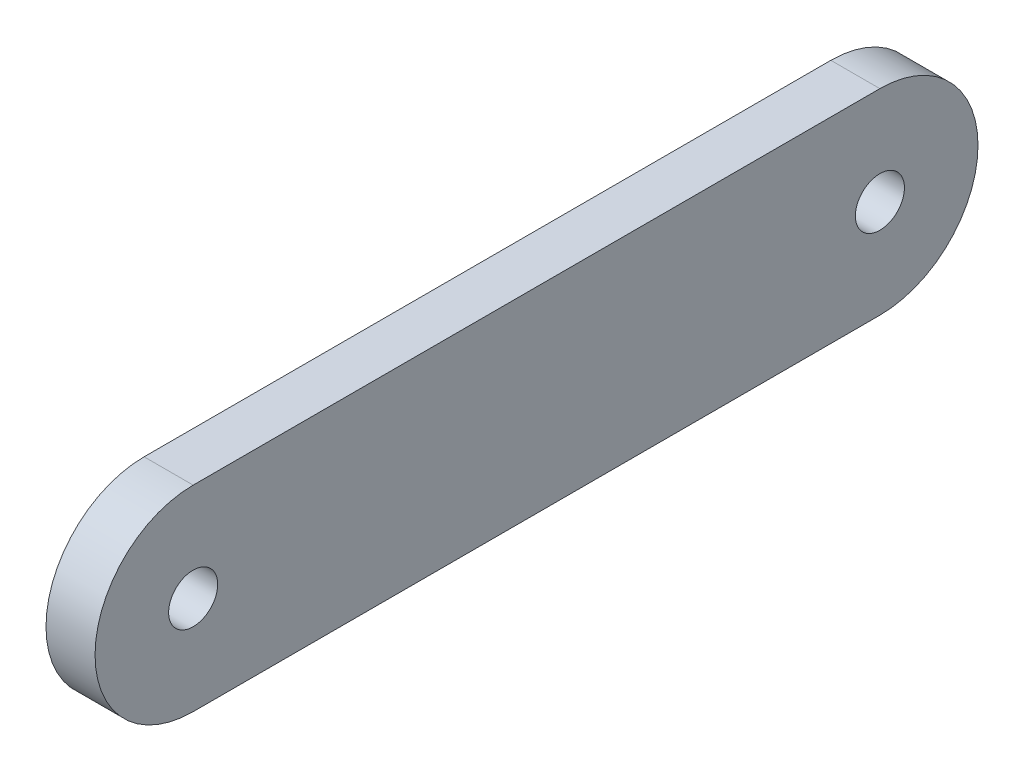
ISO-10303-21;
HEADER;
FILE_DESCRIPTION(('STEP AP214'),'2;1');
FILE_NAME('part.step','',(''),(''),'','','');
FILE_SCHEMA(('AUTOMOTIVE_DESIGN { 1 0 10303 214 1 1 1 1 }'));
ENDSEC;
DATA;
#1=APPLICATION_CONTEXT('core data for automotive mechanical design processes');
#2=APPLICATION_PROTOCOL_DEFINITION('international standard','automotive_design',2000,#1);
#3=PRODUCT_CONTEXT('',#1,'mechanical');
#4=PRODUCT('Part','Part','',(#3));
#5=PRODUCT_RELATED_PRODUCT_CATEGORY('part','',(#4));
#6=PRODUCT_DEFINITION_FORMATION('','',#4);
#7=PRODUCT_DEFINITION_CONTEXT('part definition',#1,'design');
#8=PRODUCT_DEFINITION('design','',#6,#7);
#9=PRODUCT_DEFINITION_SHAPE('','',#8);
#10=(LENGTH_UNIT() NAMED_UNIT(*) SI_UNIT(.MILLI.,.METRE.));
#11=(NAMED_UNIT(*) PLANE_ANGLE_UNIT() SI_UNIT($,.RADIAN.));
#12=(NAMED_UNIT(*) SI_UNIT($,.STERADIAN.) SOLID_ANGLE_UNIT());
#13=UNCERTAINTY_MEASURE_WITH_UNIT(LENGTH_MEASURE(1.E-05),#10,'distance_accuracy_value','');
#14=(GEOMETRIC_REPRESENTATION_CONTEXT(3) GLOBAL_UNCERTAINTY_ASSIGNED_CONTEXT((#13)) GLOBAL_UNIT_ASSIGNED_CONTEXT((#10,
#11,#12)) REPRESENTATION_CONTEXT('',''));
#15=CARTESIAN_POINT('',(0.,0.,0.));
#16=DIRECTION('',(0.,0.,1.));
#17=DIRECTION('',(1.,0.,0.));
#18=AXIS2_PLACEMENT_3D('',#15,#16,#17);
#19=CARTESIAN_POINT('',(5.,0.,0.));
#20=DIRECTION('',(1.,0.,0.));
#21=DIRECTION('',(0.,0.,-1.));
#22=AXIS2_PLACEMENT_3D('',#19,#20,#21);
#23=PLANE('',#22);
#24=CARTESIAN_POINT('',(5.,0.,0.));
#25=DIRECTION('',(1.,0.,0.));
#26=DIRECTION('',(0.,0.,-1.));
#27=AXIS2_PLACEMENT_3D('',#24,#25,#26);
#28=CIRCLE('',#27,2.5);
#29=CARTESIAN_POINT('',(5.,0.,-2.5));
#30=VERTEX_POINT('',#29);
#31=EDGE_CURVE('E100',#30,#30,#28,.T.);
#32=ORIENTED_EDGE('',*,*,#31,.F.);
#33=EDGE_LOOP('',(#32));
#34=FACE_BOUND('',#33,.T.);
#35=CARTESIAN_POINT('',(5.,0.,0.));
#36=DIRECTION('',(1.,0.,0.));
#37=DIRECTION('',(0.,0.,-1.));
#38=AXIS2_PLACEMENT_3D('',#35,#36,#37);
#39=CIRCLE('',#38,10.);
#40=CARTESIAN_POINT('',(5.,10.,0.));
#41=VERTEX_POINT('',#40);
#42=CARTESIAN_POINT('',(5.,-10.,0.));
#43=VERTEX_POINT('',#42);
#44=EDGE_CURVE('E85',#41,#43,#39,.T.);
#45=ORIENTED_EDGE('',*,*,#44,.T.);
#46=DIRECTION('',(0.,0.,-1.));
#47=VECTOR('',#46,1.);
#48=CARTESIAN_POINT('',(5.,-10.,0.));
#49=LINE('',#48,#47);
#50=CARTESIAN_POINT('',(5.,-10.,-70.));
#51=VERTEX_POINT('',#50);
#52=EDGE_CURVE('E80',#43,#51,#49,.T.);
#53=ORIENTED_EDGE('',*,*,#52,.T.);
#54=CARTESIAN_POINT('',(5.,0.,-70.));
#55=DIRECTION('',(1.,0.,0.));
#56=DIRECTION('',(0.,0.,-1.));
#57=AXIS2_PLACEMENT_3D('',#54,#55,#56);
#58=CIRCLE('',#57,10.);
#59=CARTESIAN_POINT('',(5.,10.,-70.));
#60=VERTEX_POINT('',#59);
#61=EDGE_CURVE('E83',#51,#60,#58,.T.);
#62=ORIENTED_EDGE('',*,*,#61,.T.);
#63=DIRECTION('',(0.,0.,1.));
#64=VECTOR('',#63,1.);
#65=CARTESIAN_POINT('',(5.,10.,0.));
#66=LINE('',#65,#64);
#67=EDGE_CURVE('E50',#60,#41,#66,.T.);
#68=ORIENTED_EDGE('',*,*,#67,.T.);
#69=EDGE_LOOP('',(#45,#53,#62,#68));
#70=FACE_BOUND('',#69,.T.);
#71=CARTESIAN_POINT('',(5.,0.,-70.));
#72=DIRECTION('',(1.,0.,0.));
#73=DIRECTION('',(0.,0.,-1.));
#74=AXIS2_PLACEMENT_3D('',#71,#72,#73);
#75=CIRCLE('',#74,2.5);
#76=CARTESIAN_POINT('',(5.,0.,-72.5));
#77=VERTEX_POINT('',#76);
#78=EDGE_CURVE('E115',#77,#77,#75,.T.);
#79=ORIENTED_EDGE('',*,*,#78,.F.);
#80=EDGE_LOOP('',(#79));
#81=FACE_BOUND('',#80,.T.);
#82=ADVANCED_FACE('F33',(#34,#70,#81),#23,.T.);
#83=CARTESIAN_POINT('',(0.,0.,0.));
#84=DIRECTION('',(1.,0.,0.));
#85=DIRECTION('',(0.,0.,-1.));
#86=AXIS2_PLACEMENT_3D('',#83,#84,#85);
#87=PLANE('',#86);
#88=CARTESIAN_POINT('',(0.,0.,0.));
#89=DIRECTION('',(1.,0.,0.));
#90=DIRECTION('',(0.,0.,-1.));
#91=AXIS2_PLACEMENT_3D('',#88,#89,#90);
#92=CIRCLE('',#91,10.);
#93=CARTESIAN_POINT('',(0.,10.,0.));
#94=VERTEX_POINT('',#93);
#95=CARTESIAN_POINT('',(0.,-10.,0.));
#96=VERTEX_POINT('',#95);
#97=EDGE_CURVE('E97',#94,#96,#92,.T.);
#98=ORIENTED_EDGE('',*,*,#97,.F.);
#99=DIRECTION('',(0.,0.,1.));
#100=VECTOR('',#99,1.);
#101=CARTESIAN_POINT('',(0.,10.,0.));
#102=LINE('',#101,#100);
#103=CARTESIAN_POINT('',(0.,10.,-70.));
#104=VERTEX_POINT('',#103);
#105=EDGE_CURVE('E73',#104,#94,#102,.T.);
#106=ORIENTED_EDGE('',*,*,#105,.F.);
#107=CARTESIAN_POINT('',(0.,0.,-70.));
#108=DIRECTION('',(1.,0.,0.));
#109=DIRECTION('',(0.,0.,-1.));
#110=AXIS2_PLACEMENT_3D('',#107,#108,#109);
#111=CIRCLE('',#110,10.);
#112=CARTESIAN_POINT('',(0.,-10.,-70.));
#113=VERTEX_POINT('',#112);
#114=EDGE_CURVE('E67',#113,#104,#111,.T.);
#115=ORIENTED_EDGE('',*,*,#114,.F.);
#116=DIRECTION('',(0.,0.,-1.));
#117=VECTOR('',#116,1.);
#118=CARTESIAN_POINT('',(0.,-10.,0.));
#119=LINE('',#118,#117);
#120=EDGE_CURVE('E89',#96,#113,#119,.T.);
#121=ORIENTED_EDGE('',*,*,#120,.F.);
#122=EDGE_LOOP('',(#98,#106,#115,#121));
#123=FACE_BOUND('',#122,.T.);
#124=CARTESIAN_POINT('',(0.,0.,0.));
#125=DIRECTION('',(1.,0.,0.));
#126=DIRECTION('',(0.,0.,-1.));
#127=AXIS2_PLACEMENT_3D('',#124,#125,#126);
#128=CIRCLE('',#127,2.5);
#129=CARTESIAN_POINT('',(0.,0.,-2.5));
#130=VERTEX_POINT('',#129);
#131=EDGE_CURVE('E112',#130,#130,#128,.T.);
#132=ORIENTED_EDGE('',*,*,#131,.T.);
#133=EDGE_LOOP('',(#132));
#134=FACE_BOUND('',#133,.T.);
#135=CARTESIAN_POINT('',(0.,0.,-70.));
#136=DIRECTION('',(1.,0.,0.));
#137=DIRECTION('',(0.,0.,-1.));
#138=AXIS2_PLACEMENT_3D('',#135,#136,#137);
#139=CIRCLE('',#138,2.5);
#140=CARTESIAN_POINT('',(0.,0.,-72.5));
#141=VERTEX_POINT('',#140);
#142=EDGE_CURVE('E118',#141,#141,#139,.T.);
#143=ORIENTED_EDGE('',*,*,#142,.T.);
#144=EDGE_LOOP('',(#143));
#145=FACE_BOUND('',#144,.T.);
#146=ADVANCED_FACE('F108',(#123,#134,#145),#87,.F.);
#147=CARTESIAN_POINT('',(5.,0.,0.));
#148=DIRECTION('',(-1.,0.,0.));
#149=DIRECTION('',(0.,0.,1.));
#150=AXIS2_PLACEMENT_3D('',#147,#148,#149);
#151=CYLINDRICAL_SURFACE('',#150,10.);
#152=ORIENTED_EDGE('',*,*,#97,.T.);
#153=DIRECTION('',(-1.,0.,0.));
#154=VECTOR('',#153,1.);
#155=CARTESIAN_POINT('',(5.,-10.,0.));
#156=LINE('',#155,#154);
#157=EDGE_CURVE('E11',#43,#96,#156,.T.);
#158=ORIENTED_EDGE('',*,*,#157,.F.);
#159=ORIENTED_EDGE('',*,*,#44,.F.);
#160=DIRECTION('',(-1.,0.,0.));
#161=VECTOR('',#160,1.);
#162=CARTESIAN_POINT('',(5.,10.,0.));
#163=LINE('',#162,#161);
#164=EDGE_CURVE('E93',#41,#94,#163,.T.);
#165=ORIENTED_EDGE('',*,*,#164,.T.);
#166=EDGE_LOOP('',(#152,#158,#159,#165));
#167=FACE_BOUND('',#166,.T.);
#168=ADVANCED_FACE('F35',(#167),#151,.T.);
#169=CARTESIAN_POINT('',(5.,-10.,0.));
#170=DIRECTION('',(0.,1.,0.));
#171=DIRECTION('',(0.,0.,1.));
#172=AXIS2_PLACEMENT_3D('',#169,#170,#171);
#173=PLANE('',#172);
#174=ORIENTED_EDGE('',*,*,#120,.T.);
#175=DIRECTION('',(-1.,0.,0.));
#176=VECTOR('',#175,1.);
#177=CARTESIAN_POINT('',(5.,-10.,-70.));
#178=LINE('',#177,#176);
#179=EDGE_CURVE('E42',#51,#113,#178,.T.);
#180=ORIENTED_EDGE('',*,*,#179,.F.);
#181=ORIENTED_EDGE('',*,*,#52,.F.);
#182=ORIENTED_EDGE('',*,*,#157,.T.);
#183=EDGE_LOOP('',(#174,#180,#181,#182));
#184=FACE_BOUND('',#183,.T.);
#185=ADVANCED_FACE('F88',(#184),#173,.F.);
#186=CARTESIAN_POINT('',(5.,0.,-70.));
#187=DIRECTION('',(-1.,0.,0.));
#188=DIRECTION('',(0.,0.,1.));
#189=AXIS2_PLACEMENT_3D('',#186,#187,#188);
#190=CYLINDRICAL_SURFACE('',#189,10.);
#191=ORIENTED_EDGE('',*,*,#114,.T.);
#192=DIRECTION('',(-1.,0.,0.));
#193=VECTOR('',#192,1.);
#194=CARTESIAN_POINT('',(5.,10.,-70.));
#195=LINE('',#194,#193);
#196=EDGE_CURVE('E90',#60,#104,#195,.T.);
#197=ORIENTED_EDGE('',*,*,#196,.F.);
#198=ORIENTED_EDGE('',*,*,#61,.F.);
#199=ORIENTED_EDGE('',*,*,#179,.T.);
#200=EDGE_LOOP('',(#191,#197,#198,#199));
#201=FACE_BOUND('',#200,.T.);
#202=ADVANCED_FACE('F91',(#201),#190,.T.);
#203=CARTESIAN_POINT('',(5.,10.,0.));
#204=DIRECTION('',(0.,-1.,0.));
#205=DIRECTION('',(0.,0.,-1.));
#206=AXIS2_PLACEMENT_3D('',#203,#204,#205);
#207=PLANE('',#206);
#208=ORIENTED_EDGE('',*,*,#105,.T.);
#209=ORIENTED_EDGE('',*,*,#164,.F.);
#210=ORIENTED_EDGE('',*,*,#67,.F.);
#211=ORIENTED_EDGE('',*,*,#196,.T.);
#212=EDGE_LOOP('',(#208,#209,#210,#211));
#213=FACE_BOUND('',#212,.T.);
#214=ADVANCED_FACE('F105',(#213),#207,.F.);
#215=CARTESIAN_POINT('',(5.,0.,0.));
#216=DIRECTION('',(-1.,0.,0.));
#217=DIRECTION('',(0.,0.,1.));
#218=AXIS2_PLACEMENT_3D('',#215,#216,#217);
#219=CYLINDRICAL_SURFACE('',#218,2.5);
#220=ORIENTED_EDGE('',*,*,#31,.T.);
#221=EDGE_LOOP('',(#220));
#222=FACE_BOUND('',#221,.T.);
#223=ORIENTED_EDGE('',*,*,#131,.F.);
#224=EDGE_LOOP('',(#223));
#225=FACE_BOUND('',#224,.T.);
#226=ADVANCED_FACE('F135',(#222,#225),#219,.F.);
#227=CARTESIAN_POINT('',(5.,0.,-70.));
#228=DIRECTION('',(-1.,0.,0.));
#229=DIRECTION('',(0.,0.,1.));
#230=AXIS2_PLACEMENT_3D('',#227,#228,#229);
#231=CYLINDRICAL_SURFACE('',#230,2.5);
#232=ORIENTED_EDGE('',*,*,#78,.T.);
#233=EDGE_LOOP('',(#232));
#234=FACE_BOUND('',#233,.T.);
#235=ORIENTED_EDGE('',*,*,#142,.F.);
#236=EDGE_LOOP('',(#235));
#237=FACE_BOUND('',#236,.T.);
#238=ADVANCED_FACE('F124',(#234,#237),#231,.F.);
#239=CLOSED_SHELL('',(#82,#146,#168,#185,#202,#214,#226,#238));
#240=MANIFOLD_SOLID_BREP('B2',#239);
#241=ADVANCED_BREP_SHAPE_REPRESENTATION('',(#18,#240),#14);
#242=SHAPE_DEFINITION_REPRESENTATION(#9,#241);
ENDSEC;
END-ISO-10303-21;
